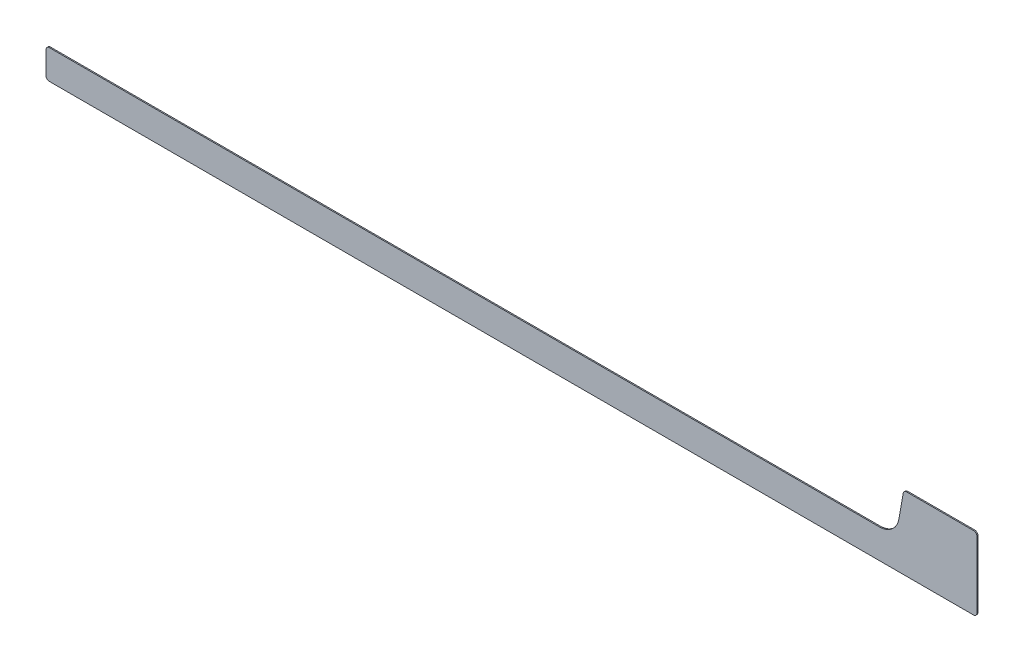
ISO-10303-21;
HEADER;
FILE_DESCRIPTION(('STEP AP214'),'2;1');
FILE_NAME('part.step','',(''),(''),'','','');
FILE_SCHEMA(('AUTOMOTIVE_DESIGN { 1 0 10303 214 1 1 1 1 }'));
ENDSEC;
DATA;
#1=APPLICATION_CONTEXT('core data for automotive mechanical design processes');
#2=APPLICATION_PROTOCOL_DEFINITION('international standard','automotive_design',2000,#1);
#3=PRODUCT_CONTEXT('',#1,'mechanical');
#4=PRODUCT('Part','Part','',(#3));
#5=PRODUCT_RELATED_PRODUCT_CATEGORY('part','',(#4));
#6=PRODUCT_DEFINITION_FORMATION('','',#4);
#7=PRODUCT_DEFINITION_CONTEXT('part definition',#1,'design');
#8=PRODUCT_DEFINITION('design','',#6,#7);
#9=PRODUCT_DEFINITION_SHAPE('','',#8);
#10=(LENGTH_UNIT() NAMED_UNIT(*) SI_UNIT(.MILLI.,.METRE.));
#11=(NAMED_UNIT(*) PLANE_ANGLE_UNIT() SI_UNIT($,.RADIAN.));
#12=(NAMED_UNIT(*) SI_UNIT($,.STERADIAN.) SOLID_ANGLE_UNIT());
#13=UNCERTAINTY_MEASURE_WITH_UNIT(LENGTH_MEASURE(1.E-05),#10,'distance_accuracy_value','');
#14=(GEOMETRIC_REPRESENTATION_CONTEXT(3) GLOBAL_UNCERTAINTY_ASSIGNED_CONTEXT((#13)) GLOBAL_UNIT_ASSIGNED_CONTEXT((#10,
#11,#12)) REPRESENTATION_CONTEXT('',''));
#15=CARTESIAN_POINT('',(0.,0.,0.));
#16=DIRECTION('',(0.,0.,1.));
#17=DIRECTION('',(1.,0.,0.));
#18=AXIS2_PLACEMENT_3D('',#15,#16,#17);
#19=CARTESIAN_POINT('',(0.,0.,0.085));
#20=DIRECTION('',(0.,0.,1.));
#21=DIRECTION('',(1.,0.,0.));
#22=AXIS2_PLACEMENT_3D('',#19,#20,#21);
#23=PLANE('',#22);
#24=DIRECTION('',(1.,0.,0.));
#25=VECTOR('',#24,1.);
#26=CARTESIAN_POINT('',(-31.25,-1.,0.085));
#27=LINE('',#26,#25);
#28=CARTESIAN_POINT('',(-31.25,-1.,0.085));
#29=VERTEX_POINT('',#28);
#30=CARTESIAN_POINT('',(38.25,-1.,0.085));
#31=VERTEX_POINT('',#30);
#32=EDGE_CURVE('E11',#29,#31,#27,.T.);
#33=ORIENTED_EDGE('',*,*,#32,.T.);
#34=CARTESIAN_POINT('',(38.25,-0.75,0.085));
#35=DIRECTION('',(0.,0.,1.));
#36=DIRECTION('',(0.,-1.,0.));
#37=AXIS2_PLACEMENT_3D('',#34,#35,#36);
#38=CIRCLE('',#37,0.25);
#39=CARTESIAN_POINT('',(38.5,-0.75,0.085));
#40=VERTEX_POINT('',#39);
#41=EDGE_CURVE('E184',#31,#40,#38,.T.);
#42=ORIENTED_EDGE('',*,*,#41,.T.);
#43=DIRECTION('',(0.,1.,0.));
#44=VECTOR('',#43,1.);
#45=CARTESIAN_POINT('',(38.5,-0.75,0.085));
#46=LINE('',#45,#44);
#47=CARTESIAN_POINT('',(38.5,4.25,0.085));
#48=VERTEX_POINT('',#47);
#49=EDGE_CURVE('E185',#40,#48,#46,.T.);
#50=ORIENTED_EDGE('',*,*,#49,.T.);
#51=CARTESIAN_POINT('',(38.25,4.25,0.085));
#52=DIRECTION('',(0.,0.,1.));
#53=DIRECTION('',(1.,0.,0.));
#54=AXIS2_PLACEMENT_3D('',#51,#52,#53);
#55=CIRCLE('',#54,0.25);
#56=CARTESIAN_POINT('',(38.25,4.5,0.085));
#57=VERTEX_POINT('',#56);
#58=EDGE_CURVE('E152',#48,#57,#55,.T.);
#59=ORIENTED_EDGE('',*,*,#58,.T.);
#60=DIRECTION('',(-1.,0.,0.));
#61=VECTOR('',#60,1.);
#62=CARTESIAN_POINT('',(38.25,4.5,0.085));
#63=LINE('',#62,#61);
#64=CARTESIAN_POINT('',(33.20977490779,4.5,0.085));
#65=VERTEX_POINT('',#64);
#66=EDGE_CURVE('E211',#57,#65,#63,.T.);
#67=ORIENTED_EDGE('',*,*,#66,.T.);
#68=CARTESIAN_POINT('',(33.20977490779,4.25,0.085));
#69=DIRECTION('',(0.,0.,1.));
#70=DIRECTION('',(0.,1.,0.));
#71=AXIS2_PLACEMENT_3D('',#68,#69,#70);
#72=CIRCLE('',#71,0.25);
#73=CARTESIAN_POINT('',(32.96357296954,4.293412044417,0.085));
#74=VERTEX_POINT('',#73);
#75=EDGE_CURVE('E161',#65,#74,#72,.T.);
#76=ORIENTED_EDGE('',*,*,#75,.T.);
#77=DIRECTION('',(-0.173648177666903,-0.984807753012213,0.));
#78=VECTOR('',#77,1.);
#79=CARTESIAN_POINT('',(32.96357296954,4.293412044417,0.085));
#80=LINE('',#79,#78);
#81=CARTESIAN_POINT('',(32.63668314641,2.4395277335,0.085));
#82=VERTEX_POINT('',#81);
#83=EDGE_CURVE('E162',#74,#82,#80,.T.);
#84=ORIENTED_EDGE('',*,*,#83,.T.);
#85=CARTESIAN_POINT('',(31.1594715169,2.7,0.085));
#86=DIRECTION('',(0.,0.,-1.));
#87=DIRECTION('',(0.984807753012213,-0.173648177666903,0.));
#88=AXIS2_PLACEMENT_3D('',#85,#86,#87);
#89=CIRCLE('',#88,1.5);
#90=CARTESIAN_POINT('',(31.1594715169,1.2,0.085));
#91=VERTEX_POINT('',#90);
#92=EDGE_CURVE('E165',#82,#91,#89,.T.);
#93=ORIENTED_EDGE('',*,*,#92,.T.);
#94=DIRECTION('',(-1.,0.,0.));
#95=VECTOR('',#94,1.);
#96=CARTESIAN_POINT('',(31.1594715169,1.2,0.085));
#97=LINE('',#96,#95);
#98=CARTESIAN_POINT('',(-31.25,1.2,0.085));
#99=VERTEX_POINT('',#98);
#100=EDGE_CURVE('E166',#91,#99,#97,.T.);
#101=ORIENTED_EDGE('',*,*,#100,.T.);
#102=CARTESIAN_POINT('',(-31.25,0.95,0.085));
#103=DIRECTION('',(0.,0.,1.));
#104=DIRECTION('',(0.,1.,0.));
#105=AXIS2_PLACEMENT_3D('',#102,#103,#104);
#106=CIRCLE('',#105,0.25);
#107=CARTESIAN_POINT('',(-31.5,0.95,0.085));
#108=VERTEX_POINT('',#107);
#109=EDGE_CURVE('E226',#99,#108,#106,.T.);
#110=ORIENTED_EDGE('',*,*,#109,.T.);
#111=DIRECTION('',(0.,-1.,0.));
#112=VECTOR('',#111,1.);
#113=CARTESIAN_POINT('',(-31.5,0.95,0.085));
#114=LINE('',#113,#112);
#115=CARTESIAN_POINT('',(-31.5,-0.75,0.085));
#116=VERTEX_POINT('',#115);
#117=EDGE_CURVE('E126',#108,#116,#114,.T.);
#118=ORIENTED_EDGE('',*,*,#117,.T.);
#119=CARTESIAN_POINT('',(-31.25,-0.75,0.085));
#120=DIRECTION('',(0.,0.,1.));
#121=DIRECTION('',(-1.,0.,0.));
#122=AXIS2_PLACEMENT_3D('',#119,#120,#121);
#123=CIRCLE('',#122,0.25);
#124=EDGE_CURVE('E124',#116,#29,#123,.T.);
#125=ORIENTED_EDGE('',*,*,#124,.T.);
#126=EDGE_LOOP('',(#33,#42,#50,#59,#67,#76,#84,#93,#101,#110,#118,#125));
#127=FACE_BOUND('',#126,.T.);
#128=ADVANCED_FACE('F16',(#127),#23,.T.);
#129=CARTESIAN_POINT('',(-31.5,-1.,0.));
#130=DIRECTION('',(0.,-1.,0.));
#131=DIRECTION('',(0.,0.,-1.));
#132=AXIS2_PLACEMENT_3D('',#129,#130,#131);
#133=PLANE('',#132);
#134=DIRECTION('',(1.,0.,0.));
#135=VECTOR('',#134,1.);
#136=CARTESIAN_POINT('',(-31.25,-1.,0.));
#137=LINE('',#136,#135);
#138=CARTESIAN_POINT('',(-31.25,-1.,0.));
#139=VERTEX_POINT('',#138);
#140=CARTESIAN_POINT('',(38.25,-1.,0.));
#141=VERTEX_POINT('',#140);
#142=EDGE_CURVE('E142',#139,#141,#137,.T.);
#143=ORIENTED_EDGE('',*,*,#142,.T.);
#144=DIRECTION('',(0.,0.,-1.));
#145=VECTOR('',#144,1.);
#146=CARTESIAN_POINT('',(38.25,-1.,0.085));
#147=LINE('',#146,#145);
#148=EDGE_CURVE('E27',#31,#141,#147,.T.);
#149=ORIENTED_EDGE('',*,*,#148,.F.);
#150=ORIENTED_EDGE('',*,*,#32,.F.);
#151=DIRECTION('',(0.,0.,-1.));
#152=VECTOR('',#151,1.);
#153=CARTESIAN_POINT('',(-31.25,-1.,0.085));
#154=LINE('',#153,#152);
#155=EDGE_CURVE('E119',#29,#139,#154,.T.);
#156=ORIENTED_EDGE('',*,*,#155,.T.);
#157=EDGE_LOOP('',(#143,#149,#150,#156));
#158=FACE_BOUND('',#157,.T.);
#159=ADVANCED_FACE('F117',(#158),#133,.T.);
#160=CARTESIAN_POINT('',(38.25,-0.75,0.394202));
#161=DIRECTION('',(0.,0.,-1.));
#162=DIRECTION('',(1.,0.,0.));
#163=AXIS2_PLACEMENT_3D('',#160,#161,#162);
#164=CYLINDRICAL_SURFACE('',#163,0.25);
#165=DIRECTION('',(0.,0.,-1.));
#166=VECTOR('',#165,1.);
#167=CARTESIAN_POINT('',(38.5,-0.75,0.085));
#168=LINE('',#167,#166);
#169=CARTESIAN_POINT('',(38.5,-0.75,0.));
#170=VERTEX_POINT('',#169);
#171=EDGE_CURVE('E181',#40,#170,#168,.T.);
#172=ORIENTED_EDGE('',*,*,#171,.F.);
#173=ORIENTED_EDGE('',*,*,#41,.F.);
#174=ORIENTED_EDGE('',*,*,#148,.T.);
#175=CARTESIAN_POINT('',(38.25,-0.75,0.));
#176=DIRECTION('',(0.,0.,-1.));
#177=DIRECTION('',(1.,0.,0.));
#178=AXIS2_PLACEMENT_3D('',#175,#176,#177);
#179=CIRCLE('',#178,0.25);
#180=EDGE_CURVE('E146',#170,#141,#179,.T.);
#181=ORIENTED_EDGE('',*,*,#180,.F.);
#182=EDGE_LOOP('',(#172,#173,#174,#181));
#183=FACE_BOUND('',#182,.T.);
#184=ADVANCED_FACE('F18',(#183),#164,.T.);
#185=CARTESIAN_POINT('',(38.5,-1.,0.));
#186=DIRECTION('',(1.,0.,0.));
#187=DIRECTION('',(0.,1.,0.));
#188=AXIS2_PLACEMENT_3D('',#185,#186,#187);
#189=PLANE('',#188);
#190=DIRECTION('',(0.,1.,0.));
#191=VECTOR('',#190,1.);
#192=CARTESIAN_POINT('',(38.5,-0.75,0.));
#193=LINE('',#192,#191);
#194=CARTESIAN_POINT('',(38.5,4.25,0.));
#195=VERTEX_POINT('',#194);
#196=EDGE_CURVE('E148',#170,#195,#193,.T.);
#197=ORIENTED_EDGE('',*,*,#196,.T.);
#198=DIRECTION('',(0.,0.,-1.));
#199=VECTOR('',#198,1.);
#200=CARTESIAN_POINT('',(38.5,4.25,0.085));
#201=LINE('',#200,#199);
#202=EDGE_CURVE('E156',#48,#195,#201,.T.);
#203=ORIENTED_EDGE('',*,*,#202,.F.);
#204=ORIENTED_EDGE('',*,*,#49,.F.);
#205=ORIENTED_EDGE('',*,*,#171,.T.);
#206=EDGE_LOOP('',(#197,#203,#204,#205));
#207=FACE_BOUND('',#206,.T.);
#208=ADVANCED_FACE('F309',(#207),#189,.T.);
#209=CARTESIAN_POINT('',(38.25,4.25,0.394202));
#210=DIRECTION('',(0.,0.,-1.));
#211=DIRECTION('',(0.,1.,0.));
#212=AXIS2_PLACEMENT_3D('',#209,#210,#211);
#213=CYLINDRICAL_SURFACE('',#212,0.25);
#214=DIRECTION('',(0.,0.,-1.));
#215=VECTOR('',#214,1.);
#216=CARTESIAN_POINT('',(38.25,4.5,0.085));
#217=LINE('',#216,#215);
#218=CARTESIAN_POINT('',(38.25,4.5,0.));
#219=VERTEX_POINT('',#218);
#220=EDGE_CURVE('E157',#57,#219,#217,.T.);
#221=ORIENTED_EDGE('',*,*,#220,.F.);
#222=ORIENTED_EDGE('',*,*,#58,.F.);
#223=ORIENTED_EDGE('',*,*,#202,.T.);
#224=CARTESIAN_POINT('',(38.25,4.25,0.));
#225=DIRECTION('',(0.,0.,-1.));
#226=DIRECTION('',(0.,1.,0.));
#227=AXIS2_PLACEMENT_3D('',#224,#225,#226);
#228=CIRCLE('',#227,0.25);
#229=EDGE_CURVE('E151',#219,#195,#228,.T.);
#230=ORIENTED_EDGE('',*,*,#229,.F.);
#231=EDGE_LOOP('',(#221,#222,#223,#230));
#232=FACE_BOUND('',#231,.T.);
#233=ADVANCED_FACE('F269',(#232),#213,.T.);
#234=CARTESIAN_POINT('',(38.5,4.5,0.));
#235=DIRECTION('',(0.,1.,0.));
#236=DIRECTION('',(1.,0.,0.));
#237=AXIS2_PLACEMENT_3D('',#234,#235,#236);
#238=PLANE('',#237);
#239=DIRECTION('',(-1.,0.,0.));
#240=VECTOR('',#239,1.);
#241=CARTESIAN_POINT('',(38.25,4.5,0.));
#242=LINE('',#241,#240);
#243=CARTESIAN_POINT('',(33.20977490779,4.5,0.));
#244=VERTEX_POINT('',#243);
#245=EDGE_CURVE('E201',#219,#244,#242,.T.);
#246=ORIENTED_EDGE('',*,*,#245,.T.);
#247=DIRECTION('',(0.,0.,-1.));
#248=VECTOR('',#247,1.);
#249=CARTESIAN_POINT('',(33.20977490779,4.5,0.085));
#250=LINE('',#249,#248);
#251=EDGE_CURVE('E169',#65,#244,#250,.T.);
#252=ORIENTED_EDGE('',*,*,#251,.F.);
#253=ORIENTED_EDGE('',*,*,#66,.F.);
#254=ORIENTED_EDGE('',*,*,#220,.T.);
#255=EDGE_LOOP('',(#246,#252,#253,#254));
#256=FACE_BOUND('',#255,.T.);
#257=ADVANCED_FACE('F273',(#256),#238,.T.);
#258=CARTESIAN_POINT('',(33.20977490779,4.25,0.394202));
#259=DIRECTION('',(0.,0.,-1.));
#260=DIRECTION('',(-0.984807753012213,0.173648177666903,0.));
#261=AXIS2_PLACEMENT_3D('',#258,#259,#260);
#262=CYLINDRICAL_SURFACE('',#261,0.25);
#263=DIRECTION('',(0.,0.,-1.));
#264=VECTOR('',#263,1.);
#265=CARTESIAN_POINT('',(32.96357296954,4.293412044417,0.085));
#266=LINE('',#265,#264);
#267=CARTESIAN_POINT('',(32.96357296954,4.293412044417,0.));
#268=VERTEX_POINT('',#267);
#269=EDGE_CURVE('E158',#74,#268,#266,.T.);
#270=ORIENTED_EDGE('',*,*,#269,.F.);
#271=ORIENTED_EDGE('',*,*,#75,.F.);
#272=ORIENTED_EDGE('',*,*,#251,.T.);
#273=CARTESIAN_POINT('',(33.20977490779,4.25,0.));
#274=DIRECTION('',(0.,0.,-1.));
#275=DIRECTION('',(-0.984807753012213,0.173648177666903,0.));
#276=AXIS2_PLACEMENT_3D('',#273,#274,#275);
#277=CIRCLE('',#276,0.25);
#278=EDGE_CURVE('E197',#268,#244,#277,.T.);
#279=ORIENTED_EDGE('',*,*,#278,.F.);
#280=EDGE_LOOP('',(#270,#271,#272,#279));
#281=FACE_BOUND('',#280,.T.);
#282=ADVANCED_FACE('F278',(#281),#262,.T.);
#283=CARTESIAN_POINT('',(33.,4.5,0.));
#284=DIRECTION('',(-0.984807753012213,0.173648177666903,0.));
#285=DIRECTION('',(0.,0.,1.));
#286=AXIS2_PLACEMENT_3D('',#283,#284,#285);
#287=PLANE('',#286);
#288=DIRECTION('',(-0.173648177666903,-0.984807753012213,0.));
#289=VECTOR('',#288,1.);
#290=CARTESIAN_POINT('',(32.96357296954,4.293412044417,0.));
#291=LINE('',#290,#289);
#292=CARTESIAN_POINT('',(32.63668314641,2.4395277335,0.));
#293=VERTEX_POINT('',#292);
#294=EDGE_CURVE('E202',#268,#293,#291,.T.);
#295=ORIENTED_EDGE('',*,*,#294,.T.);
#296=DIRECTION('',(0.,0.,1.));
#297=VECTOR('',#296,1.);
#298=CARTESIAN_POINT('',(32.63668314641,2.4395277335,0.));
#299=LINE('',#298,#297);
#300=EDGE_CURVE('E72',#293,#82,#299,.T.);
#301=ORIENTED_EDGE('',*,*,#300,.T.);
#302=ORIENTED_EDGE('',*,*,#83,.F.);
#303=ORIENTED_EDGE('',*,*,#269,.T.);
#304=EDGE_LOOP('',(#295,#301,#302,#303));
#305=FACE_BOUND('',#304,.T.);
#306=ADVANCED_FACE('F244',(#305),#287,.T.);
#307=CARTESIAN_POINT('',(31.1594715169,2.7,-1.812202));
#308=DIRECTION('',(0.,0.,1.));
#309=DIRECTION('',(0.,-1.,0.));
#310=AXIS2_PLACEMENT_3D('',#307,#308,#309);
#311=CYLINDRICAL_SURFACE('',#310,1.5);
#312=ORIENTED_EDGE('',*,*,#92,.F.);
#313=ORIENTED_EDGE('',*,*,#300,.F.);
#314=CARTESIAN_POINT('',(31.1594715169,2.7,0.));
#315=DIRECTION('',(0.,0.,1.));
#316=DIRECTION('',(0.,-1.,0.));
#317=AXIS2_PLACEMENT_3D('',#314,#315,#316);
#318=CIRCLE('',#317,1.5);
#319=CARTESIAN_POINT('',(31.1594715169,1.2,0.));
#320=VERTEX_POINT('',#319);
#321=EDGE_CURVE('E176',#320,#293,#318,.T.);
#322=ORIENTED_EDGE('',*,*,#321,.F.);
#323=DIRECTION('',(0.,0.,1.));
#324=VECTOR('',#323,1.);
#325=CARTESIAN_POINT('',(31.1594715169,1.2,0.));
#326=LINE('',#325,#324);
#327=EDGE_CURVE('E81',#320,#91,#326,.T.);
#328=ORIENTED_EDGE('',*,*,#327,.T.);
#329=EDGE_LOOP('',(#312,#313,#322,#328));
#330=FACE_BOUND('',#329,.T.);
#331=ADVANCED_FACE('F250',(#330),#311,.F.);
#332=CARTESIAN_POINT('',(32.41812096366,1.2,0.));
#333=DIRECTION('',(0.,1.,0.));
#334=DIRECTION('',(1.,0.,0.));
#335=AXIS2_PLACEMENT_3D('',#332,#333,#334);
#336=PLANE('',#335);
#337=ORIENTED_EDGE('',*,*,#100,.F.);
#338=ORIENTED_EDGE('',*,*,#327,.F.);
#339=DIRECTION('',(-1.,0.,0.));
#340=VECTOR('',#339,1.);
#341=CARTESIAN_POINT('',(31.1594715169,1.2,0.));
#342=LINE('',#341,#340);
#343=CARTESIAN_POINT('',(-31.25,1.2,0.));
#344=VERTEX_POINT('',#343);
#345=EDGE_CURVE('E173',#320,#344,#342,.T.);
#346=ORIENTED_EDGE('',*,*,#345,.T.);
#347=DIRECTION('',(0.,0.,-1.));
#348=VECTOR('',#347,1.);
#349=CARTESIAN_POINT('',(-31.25,1.2,0.085));
#350=LINE('',#349,#348);
#351=EDGE_CURVE('E20',#99,#344,#350,.T.);
#352=ORIENTED_EDGE('',*,*,#351,.F.);
#353=EDGE_LOOP('',(#337,#338,#346,#352));
#354=FACE_BOUND('',#353,.T.);
#355=ADVANCED_FACE('F333',(#354),#336,.T.);
#356=CARTESIAN_POINT('',(-31.25,0.95,0.394202));
#357=DIRECTION('',(0.,0.,-1.));
#358=DIRECTION('',(-1.,0.,0.));
#359=AXIS2_PLACEMENT_3D('',#356,#357,#358);
#360=CYLINDRICAL_SURFACE('',#359,0.25);
#361=DIRECTION('',(0.,0.,-1.));
#362=VECTOR('',#361,1.);
#363=CARTESIAN_POINT('',(-31.5,0.95,0.085));
#364=LINE('',#363,#362);
#365=CARTESIAN_POINT('',(-31.5,0.95,0.));
#366=VERTEX_POINT('',#365);
#367=EDGE_CURVE('E205',#108,#366,#364,.T.);
#368=ORIENTED_EDGE('',*,*,#367,.F.);
#369=ORIENTED_EDGE('',*,*,#109,.F.);
#370=ORIENTED_EDGE('',*,*,#351,.T.);
#371=CARTESIAN_POINT('',(-31.25,0.95,0.));
#372=DIRECTION('',(0.,0.,-1.));
#373=DIRECTION('',(-1.,0.,0.));
#374=AXIS2_PLACEMENT_3D('',#371,#372,#373);
#375=CIRCLE('',#374,0.25);
#376=EDGE_CURVE('E177',#366,#344,#375,.T.);
#377=ORIENTED_EDGE('',*,*,#376,.F.);
#378=EDGE_LOOP('',(#368,#369,#370,#377));
#379=FACE_BOUND('',#378,.T.);
#380=ADVANCED_FACE('F294',(#379),#360,.T.);
#381=CARTESIAN_POINT('',(-31.5,1.2,0.));
#382=DIRECTION('',(-1.,0.,0.));
#383=DIRECTION('',(0.,0.,1.));
#384=AXIS2_PLACEMENT_3D('',#381,#382,#383);
#385=PLANE('',#384);
#386=ORIENTED_EDGE('',*,*,#117,.F.);
#387=ORIENTED_EDGE('',*,*,#367,.T.);
#388=DIRECTION('',(0.,-1.,0.));
#389=VECTOR('',#388,1.);
#390=CARTESIAN_POINT('',(-31.5,0.95,0.));
#391=LINE('',#390,#389);
#392=CARTESIAN_POINT('',(-31.5,-0.75,0.));
#393=VERTEX_POINT('',#392);
#394=EDGE_CURVE('E214',#366,#393,#391,.T.);
#395=ORIENTED_EDGE('',*,*,#394,.T.);
#396=DIRECTION('',(0.,0.,-1.));
#397=VECTOR('',#396,1.);
#398=CARTESIAN_POINT('',(-31.5,-0.75,0.085));
#399=LINE('',#398,#397);
#400=EDGE_CURVE('E130',#116,#393,#399,.T.);
#401=ORIENTED_EDGE('',*,*,#400,.F.);
#402=EDGE_LOOP('',(#386,#387,#395,#401));
#403=FACE_BOUND('',#402,.T.);
#404=ADVANCED_FACE('F291',(#403),#385,.T.);
#405=CARTESIAN_POINT('',(-31.25,-0.75,0.394202));
#406=DIRECTION('',(0.,0.,-1.));
#407=DIRECTION('',(0.,-1.,0.));
#408=AXIS2_PLACEMENT_3D('',#405,#406,#407);
#409=CYLINDRICAL_SURFACE('',#408,0.25);
#410=ORIENTED_EDGE('',*,*,#155,.F.);
#411=ORIENTED_EDGE('',*,*,#124,.F.);
#412=ORIENTED_EDGE('',*,*,#400,.T.);
#413=CARTESIAN_POINT('',(-31.25,-0.75,0.));
#414=DIRECTION('',(0.,0.,-1.));
#415=DIRECTION('',(0.,-1.,0.));
#416=AXIS2_PLACEMENT_3D('',#413,#414,#415);
#417=CIRCLE('',#416,0.25);
#418=EDGE_CURVE('E134',#139,#393,#417,.T.);
#419=ORIENTED_EDGE('',*,*,#418,.F.);
#420=EDGE_LOOP('',(#410,#411,#412,#419));
#421=FACE_BOUND('',#420,.T.);
#422=ADVANCED_FACE('F132',(#421),#409,.T.);
#423=CARTESIAN_POINT('',(0.,0.,0.));
#424=DIRECTION('',(0.,0.,1.));
#425=DIRECTION('',(1.,0.,0.));
#426=AXIS2_PLACEMENT_3D('',#423,#424,#425);
#427=PLANE('',#426);
#428=ORIENTED_EDGE('',*,*,#394,.F.);
#429=ORIENTED_EDGE('',*,*,#376,.T.);
#430=ORIENTED_EDGE('',*,*,#345,.F.);
#431=ORIENTED_EDGE('',*,*,#321,.T.);
#432=ORIENTED_EDGE('',*,*,#294,.F.);
#433=ORIENTED_EDGE('',*,*,#278,.T.);
#434=ORIENTED_EDGE('',*,*,#245,.F.);
#435=ORIENTED_EDGE('',*,*,#229,.T.);
#436=ORIENTED_EDGE('',*,*,#196,.F.);
#437=ORIENTED_EDGE('',*,*,#180,.T.);
#438=ORIENTED_EDGE('',*,*,#142,.F.);
#439=ORIENTED_EDGE('',*,*,#418,.T.);
#440=EDGE_LOOP('',(#428,#429,#430,#431,#432,#433,#434,#435,#436,#437,#438,#439));
#441=FACE_BOUND('',#440,.T.);
#442=ADVANCED_FACE('F281',(#441),#427,.F.);
#443=CLOSED_SHELL('',(#128,#159,#184,#208,#233,#257,#282,#306,#331,#355,#380,#404,#422,#442));
#444=MANIFOLD_SOLID_BREP('B1',#443);
#445=ADVANCED_BREP_SHAPE_REPRESENTATION('',(#18,#444),#14);
#446=SHAPE_DEFINITION_REPRESENTATION(#9,#445);
ENDSEC;
END-ISO-10303-21;
